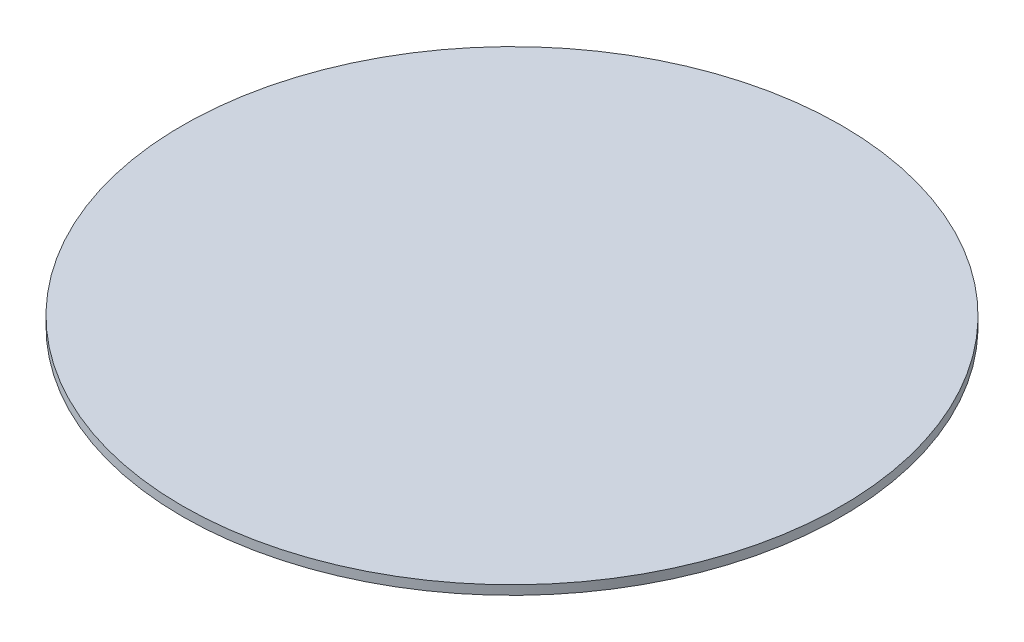
ISO-10303-21;
HEADER;
FILE_DESCRIPTION(('STEP AP214'),'2;1');
FILE_NAME('part.step','',(''),(''),'','','');
FILE_SCHEMA(('AUTOMOTIVE_DESIGN { 1 0 10303 214 1 1 1 1 }'));
ENDSEC;
DATA;
#1=APPLICATION_CONTEXT('core data for automotive mechanical design processes');
#2=APPLICATION_PROTOCOL_DEFINITION('international standard','automotive_design',2000,#1);
#3=PRODUCT_CONTEXT('',#1,'mechanical');
#4=PRODUCT('Part','Part','',(#3));
#5=PRODUCT_RELATED_PRODUCT_CATEGORY('part','',(#4));
#6=PRODUCT_DEFINITION_FORMATION('','',#4);
#7=PRODUCT_DEFINITION_CONTEXT('part definition',#1,'design');
#8=PRODUCT_DEFINITION('design','',#6,#7);
#9=PRODUCT_DEFINITION_SHAPE('','',#8);
#10=(LENGTH_UNIT() NAMED_UNIT(*) SI_UNIT(.MILLI.,.METRE.));
#11=(NAMED_UNIT(*) PLANE_ANGLE_UNIT() SI_UNIT($,.RADIAN.));
#12=(NAMED_UNIT(*) SI_UNIT($,.STERADIAN.) SOLID_ANGLE_UNIT());
#13=UNCERTAINTY_MEASURE_WITH_UNIT(LENGTH_MEASURE(1.E-05),#10,'distance_accuracy_value','');
#14=(GEOMETRIC_REPRESENTATION_CONTEXT(3) GLOBAL_UNCERTAINTY_ASSIGNED_CONTEXT((#13)) GLOBAL_UNIT_ASSIGNED_CONTEXT((#10,
#11,#12)) REPRESENTATION_CONTEXT('',''));
#15=CARTESIAN_POINT('',(0.,0.,0.));
#16=DIRECTION('',(0.,0.,1.));
#17=DIRECTION('',(1.,0.,0.));
#18=AXIS2_PLACEMENT_3D('',#15,#16,#17);
#19=CARTESIAN_POINT('',(0.,3.,0.));
#20=DIRECTION('',(0.,-1.,0.));
#21=DIRECTION('',(0.,0.,-1.));
#22=AXIS2_PLACEMENT_3D('',#19,#20,#21);
#23=CYLINDRICAL_SURFACE('',#22,107.5);
#24=CARTESIAN_POINT('',(0.,3.,0.));
#25=DIRECTION('',(0.,1.,0.));
#26=DIRECTION('',(0.,0.,1.));
#27=AXIS2_PLACEMENT_3D('',#24,#25,#26);
#28=CIRCLE('',#27,107.5);
#29=CARTESIAN_POINT('',(0.,3.,107.5));
#30=VERTEX_POINT('',#29);
#31=EDGE_CURVE('E10',#30,#30,#28,.T.);
#32=ORIENTED_EDGE('',*,*,#31,.F.);
#33=EDGE_LOOP('',(#32));
#34=FACE_BOUND('',#33,.T.);
#35=CARTESIAN_POINT('',(0.,0.,0.));
#36=DIRECTION('',(0.,1.,0.));
#37=DIRECTION('',(0.,0.,1.));
#38=AXIS2_PLACEMENT_3D('',#35,#36,#37);
#39=CIRCLE('',#38,107.5);
#40=CARTESIAN_POINT('',(0.,0.,107.5));
#41=VERTEX_POINT('',#40);
#42=EDGE_CURVE('E38',#41,#41,#39,.T.);
#43=ORIENTED_EDGE('',*,*,#42,.T.);
#44=EDGE_LOOP('',(#43));
#45=FACE_BOUND('',#44,.T.);
#46=ADVANCED_FACE('F35',(#34,#45),#23,.T.);
#47=CARTESIAN_POINT('',(0.,3.,0.));
#48=DIRECTION('',(0.,1.,0.));
#49=DIRECTION('',(0.,0.,1.));
#50=AXIS2_PLACEMENT_3D('',#47,#48,#49);
#51=PLANE('',#50);
#52=ORIENTED_EDGE('',*,*,#31,.T.);
#53=EDGE_LOOP('',(#52));
#54=FACE_BOUND('',#53,.T.);
#55=ADVANCED_FACE('F50',(#54),#51,.T.);
#56=CARTESIAN_POINT('',(0.,0.,0.));
#57=DIRECTION('',(0.,1.,0.));
#58=DIRECTION('',(0.,0.,1.));
#59=AXIS2_PLACEMENT_3D('',#56,#57,#58);
#60=PLANE('',#59);
#61=ORIENTED_EDGE('',*,*,#42,.F.);
#62=EDGE_LOOP('',(#61));
#63=FACE_BOUND('',#62,.T.);
#64=ADVANCED_FACE('F48',(#63),#60,.F.);
#65=CLOSED_SHELL('',(#46,#55,#64));
#66=MANIFOLD_SOLID_BREP('B2',#65);
#67=ADVANCED_BREP_SHAPE_REPRESENTATION('',(#18,#66),#14);
#68=SHAPE_DEFINITION_REPRESENTATION(#9,#67);
ENDSEC;
END-ISO-10303-21;
